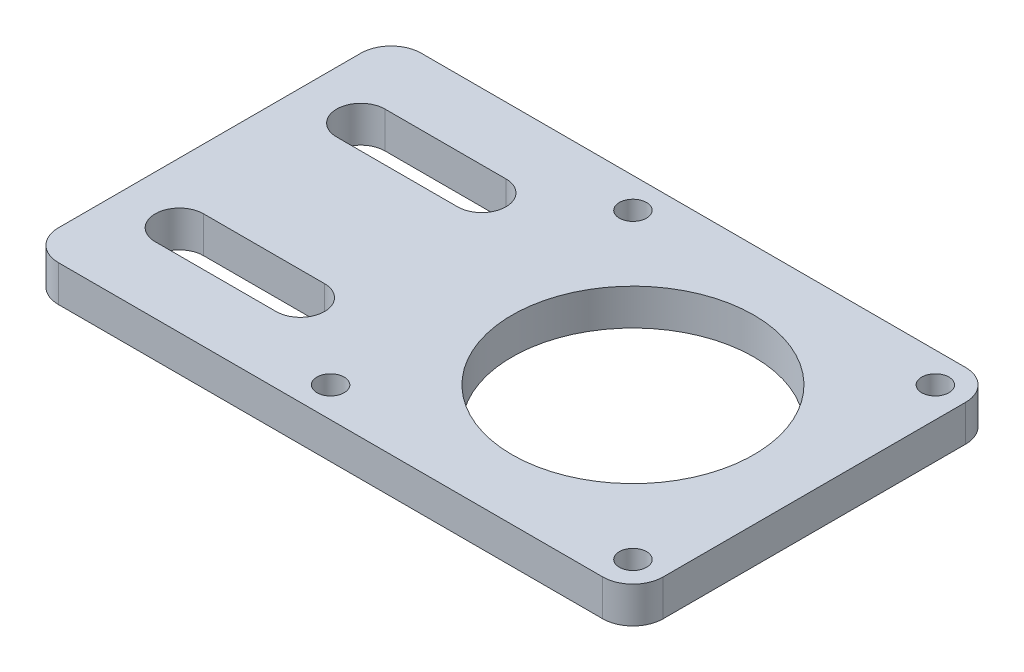
ISO-10303-21;
HEADER;
FILE_DESCRIPTION(('STEP AP214'),'2;1');
FILE_NAME('part.step','',(''),(''),'','','');
FILE_SCHEMA(('AUTOMOTIVE_DESIGN { 1 0 10303 214 1 1 1 1 }'));
ENDSEC;
DATA;
#1=APPLICATION_CONTEXT('core data for automotive mechanical design processes');
#2=APPLICATION_PROTOCOL_DEFINITION('international standard','automotive_design',2000,#1);
#3=PRODUCT_CONTEXT('',#1,'mechanical');
#4=PRODUCT('Part','Part','',(#3));
#5=PRODUCT_RELATED_PRODUCT_CATEGORY('part','',(#4));
#6=PRODUCT_DEFINITION_FORMATION('','',#4);
#7=PRODUCT_DEFINITION_CONTEXT('part definition',#1,'design');
#8=PRODUCT_DEFINITION('design','',#6,#7);
#9=PRODUCT_DEFINITION_SHAPE('','',#8);
#10=(LENGTH_UNIT() NAMED_UNIT(*) SI_UNIT(.MILLI.,.METRE.));
#11=(NAMED_UNIT(*) PLANE_ANGLE_UNIT() SI_UNIT($,.RADIAN.));
#12=(NAMED_UNIT(*) SI_UNIT($,.STERADIAN.) SOLID_ANGLE_UNIT());
#13=UNCERTAINTY_MEASURE_WITH_UNIT(LENGTH_MEASURE(1.E-05),#10,'distance_accuracy_value','');
#14=(GEOMETRIC_REPRESENTATION_CONTEXT(3) GLOBAL_UNCERTAINTY_ASSIGNED_CONTEXT((#13)) GLOBAL_UNIT_ASSIGNED_CONTEXT((#10,
#11,#12)) REPRESENTATION_CONTEXT('',''));
#15=CARTESIAN_POINT('',(0.,0.,0.));
#16=DIRECTION('',(0.,0.,1.));
#17=DIRECTION('',(1.,0.,0.));
#18=AXIS2_PLACEMENT_3D('',#15,#16,#17);
#19=CARTESIAN_POINT('',(5.,6.,25.));
#20=DIRECTION('',(0.,1.,0.));
#21=DIRECTION('',(0.,0.,1.));
#22=AXIS2_PLACEMENT_3D('',#19,#20,#21);
#23=PLANE('',#22);
#24=DIRECTION('',(1.,0.,0.));
#25=VECTOR('',#24,1.);
#26=CARTESIAN_POINT('',(10.,6.,-11.));
#27=LINE('',#26,#25);
#28=CARTESIAN_POINT('',(10.,6.,-11.));
#29=VERTEX_POINT('',#28);
#30=CARTESIAN_POINT('',(30.,6.,-11.));
#31=VERTEX_POINT('',#30);
#32=EDGE_CURVE('E214',#29,#31,#27,.T.);
#33=ORIENTED_EDGE('',*,*,#32,.F.);
#34=CARTESIAN_POINT('',(10.,6.,-15.));
#35=DIRECTION('',(0.,1.,0.));
#36=DIRECTION('',(0.,0.,1.));
#37=AXIS2_PLACEMENT_3D('',#34,#35,#36);
#38=CIRCLE('',#37,4.);
#39=CARTESIAN_POINT('',(10.,6.,-19.));
#40=VERTEX_POINT('',#39);
#41=EDGE_CURVE('E211',#40,#29,#38,.T.);
#42=ORIENTED_EDGE('',*,*,#41,.F.);
#43=DIRECTION('',(-1.,0.,0.));
#44=VECTOR('',#43,1.);
#45=CARTESIAN_POINT('',(10.,6.,-19.));
#46=LINE('',#45,#44);
#47=CARTESIAN_POINT('',(30.,6.,-19.));
#48=VERTEX_POINT('',#47);
#49=EDGE_CURVE('E222',#48,#40,#46,.T.);
#50=ORIENTED_EDGE('',*,*,#49,.F.);
#51=CARTESIAN_POINT('',(30.,6.,-15.));
#52=DIRECTION('',(0.,1.,0.));
#53=DIRECTION('',(0.,0.,1.));
#54=AXIS2_PLACEMENT_3D('',#51,#52,#53);
#55=CIRCLE('',#54,4.);
#56=EDGE_CURVE('E218',#31,#48,#55,.T.);
#57=ORIENTED_EDGE('',*,*,#56,.F.);
#58=EDGE_LOOP('',(#33,#42,#50,#57));
#59=FACE_BOUND('',#58,.T.);
#60=CARTESIAN_POINT('',(95.,6.,25.));
#61=DIRECTION('',(0.,1.,0.));
#62=DIRECTION('',(0.,0.,-1.));
#63=AXIS2_PLACEMENT_3D('',#60,#61,#62);
#64=CIRCLE('',#63,2.25);
#65=CARTESIAN_POINT('',(95.,6.,22.75));
#66=VERTEX_POINT('',#65);
#67=EDGE_CURVE('E254',#66,#66,#64,.T.);
#68=ORIENTED_EDGE('',*,*,#67,.F.);
#69=EDGE_LOOP('',(#68));
#70=FACE_BOUND('',#69,.T.);
#71=CARTESIAN_POINT('',(45.,6.,-25.));
#72=DIRECTION('',(0.,1.,0.));
#73=DIRECTION('',(0.,0.,1.));
#74=AXIS2_PLACEMENT_3D('',#71,#72,#73);
#75=CIRCLE('',#74,2.25);
#76=CARTESIAN_POINT('',(45.,6.,-22.75));
#77=VERTEX_POINT('',#76);
#78=EDGE_CURVE('E270',#77,#77,#75,.T.);
#79=ORIENTED_EDGE('',*,*,#78,.F.);
#80=EDGE_LOOP('',(#79));
#81=FACE_BOUND('',#80,.T.);
#82=CARTESIAN_POINT('',(5.,6.,25.));
#83=DIRECTION('',(0.,1.,0.));
#84=DIRECTION('',(0.,0.,1.));
#85=AXIS2_PLACEMENT_3D('',#82,#83,#84);
#86=CIRCLE('',#85,5.);
#87=CARTESIAN_POINT('',(0.,6.,25.));
#88=VERTEX_POINT('',#87);
#89=CARTESIAN_POINT('',(5.00000000000003,6.,30.));
#90=VERTEX_POINT('',#89);
#91=EDGE_CURVE('E286',#88,#90,#86,.T.);
#92=ORIENTED_EDGE('',*,*,#91,.T.);
#93=DIRECTION('',(1.,0.,0.));
#94=VECTOR('',#93,1.);
#95=CARTESIAN_POINT('',(5.00000000000003,6.,30.));
#96=LINE('',#95,#94);
#97=CARTESIAN_POINT('',(95.,6.,30.));
#98=VERTEX_POINT('',#97);
#99=EDGE_CURVE('E290',#90,#98,#96,.T.);
#100=ORIENTED_EDGE('',*,*,#99,.T.);
#101=CARTESIAN_POINT('',(95.,6.,25.));
#102=DIRECTION('',(0.,1.,0.));
#103=DIRECTION('',(0.,0.,1.));
#104=AXIS2_PLACEMENT_3D('',#101,#102,#103);
#105=CIRCLE('',#104,5.);
#106=CARTESIAN_POINT('',(100.,6.,25.));
#107=VERTEX_POINT('',#106);
#108=EDGE_CURVE('E294',#98,#107,#105,.T.);
#109=ORIENTED_EDGE('',*,*,#108,.T.);
#110=DIRECTION('',(0.,0.,-1.));
#111=VECTOR('',#110,1.);
#112=CARTESIAN_POINT('',(100.,6.,-25.));
#113=LINE('',#112,#111);
#114=CARTESIAN_POINT('',(100.,6.,-25.));
#115=VERTEX_POINT('',#114);
#116=EDGE_CURVE('E297',#107,#115,#113,.T.);
#117=ORIENTED_EDGE('',*,*,#116,.T.);
#118=CARTESIAN_POINT('',(95.,6.,-25.));
#119=DIRECTION('',(0.,1.,0.));
#120=DIRECTION('',(0.,0.,-1.));
#121=AXIS2_PLACEMENT_3D('',#118,#119,#120);
#122=CIRCLE('',#121,5.);
#123=CARTESIAN_POINT('',(95.,6.,-30.));
#124=VERTEX_POINT('',#123);
#125=EDGE_CURVE('E300',#115,#124,#122,.T.);
#126=ORIENTED_EDGE('',*,*,#125,.T.);
#127=DIRECTION('',(-1.,0.,0.));
#128=VECTOR('',#127,1.);
#129=CARTESIAN_POINT('',(5.00000000000003,6.,-30.));
#130=LINE('',#129,#128);
#131=CARTESIAN_POINT('',(5.00000000000003,6.,-30.));
#132=VERTEX_POINT('',#131);
#133=EDGE_CURVE('E303',#124,#132,#130,.T.);
#134=ORIENTED_EDGE('',*,*,#133,.T.);
#135=CARTESIAN_POINT('',(5.,6.,-25.));
#136=DIRECTION('',(0.,1.,0.));
#137=DIRECTION('',(0.,0.,1.));
#138=AXIS2_PLACEMENT_3D('',#135,#136,#137);
#139=CIRCLE('',#138,5.);
#140=CARTESIAN_POINT('',(0.,6.,-25.));
#141=VERTEX_POINT('',#140);
#142=EDGE_CURVE('E306',#132,#141,#139,.T.);
#143=ORIENTED_EDGE('',*,*,#142,.T.);
#144=DIRECTION('',(0.,0.,1.));
#145=VECTOR('',#144,1.);
#146=CARTESIAN_POINT('',(0.,6.,25.));
#147=LINE('',#146,#145);
#148=EDGE_CURVE('E309',#141,#88,#147,.T.);
#149=ORIENTED_EDGE('',*,*,#148,.T.);
#150=EDGE_LOOP('',(#92,#100,#109,#117,#126,#134,#143,#149));
#151=FACE_BOUND('',#150,.T.);
#152=CARTESIAN_POINT('',(95.,6.,-25.));
#153=DIRECTION('',(0.,1.,0.));
#154=DIRECTION('',(0.,0.,1.));
#155=AXIS2_PLACEMENT_3D('',#152,#153,#154);
#156=CIRCLE('',#155,2.25);
#157=CARTESIAN_POINT('',(95.,6.,-22.75));
#158=VERTEX_POINT('',#157);
#159=EDGE_CURVE('E278',#158,#158,#156,.T.);
#160=ORIENTED_EDGE('',*,*,#159,.F.);
#161=EDGE_LOOP('',(#160));
#162=FACE_BOUND('',#161,.T.);
#163=CARTESIAN_POINT('',(45.,6.,25.));
#164=DIRECTION('',(0.,1.,0.));
#165=DIRECTION('',(0.,0.,-1.));
#166=AXIS2_PLACEMENT_3D('',#163,#164,#165);
#167=CIRCLE('',#166,2.25);
#168=CARTESIAN_POINT('',(45.,6.,22.75));
#169=VERTEX_POINT('',#168);
#170=EDGE_CURVE('E262',#169,#169,#167,.T.);
#171=ORIENTED_EDGE('',*,*,#170,.F.);
#172=EDGE_LOOP('',(#171));
#173=FACE_BOUND('',#172,.T.);
#174=CARTESIAN_POINT('',(70.,6.,0.));
#175=DIRECTION('',(0.,1.,0.));
#176=DIRECTION('',(0.,0.,1.));
#177=AXIS2_PLACEMENT_3D('',#174,#175,#176);
#178=CIRCLE('',#177,20.);
#179=CARTESIAN_POINT('',(70.,6.,20.));
#180=VERTEX_POINT('',#179);
#181=EDGE_CURVE('E203',#180,#180,#178,.T.);
#182=ORIENTED_EDGE('',*,*,#181,.F.);
#183=EDGE_LOOP('',(#182));
#184=FACE_BOUND('',#183,.T.);
#185=DIRECTION('',(1.,0.,0.));
#186=VECTOR('',#185,1.);
#187=CARTESIAN_POINT('',(10.,6.,19.));
#188=LINE('',#187,#186);
#189=CARTESIAN_POINT('',(10.,6.,19.));
#190=VERTEX_POINT('',#189);
#191=CARTESIAN_POINT('',(30.,6.,19.));
#192=VERTEX_POINT('',#191);
#193=EDGE_CURVE('E164',#190,#192,#188,.T.);
#194=ORIENTED_EDGE('',*,*,#193,.F.);
#195=CARTESIAN_POINT('',(10.,6.,15.));
#196=DIRECTION('',(0.,1.,0.));
#197=DIRECTION('',(0.,0.,-1.));
#198=AXIS2_PLACEMENT_3D('',#195,#196,#197);
#199=CIRCLE('',#198,4.);
#200=CARTESIAN_POINT('',(10.,6.,11.));
#201=VERTEX_POINT('',#200);
#202=EDGE_CURVE('E155',#201,#190,#199,.T.);
#203=ORIENTED_EDGE('',*,*,#202,.F.);
#204=DIRECTION('',(-1.,0.,0.));
#205=VECTOR('',#204,1.);
#206=CARTESIAN_POINT('',(10.,6.,11.));
#207=LINE('',#206,#205);
#208=CARTESIAN_POINT('',(30.,6.,11.));
#209=VERTEX_POINT('',#208);
#210=EDGE_CURVE('E181',#209,#201,#207,.T.);
#211=ORIENTED_EDGE('',*,*,#210,.F.);
#212=CARTESIAN_POINT('',(30.,6.,15.));
#213=DIRECTION('',(0.,1.,0.));
#214=DIRECTION('',(0.,0.,-1.));
#215=AXIS2_PLACEMENT_3D('',#212,#213,#214);
#216=CIRCLE('',#215,4.);
#217=EDGE_CURVE('E177',#192,#209,#216,.T.);
#218=ORIENTED_EDGE('',*,*,#217,.F.);
#219=EDGE_LOOP('',(#194,#203,#211,#218));
#220=FACE_BOUND('',#219,.T.);
#221=ADVANCED_FACE('F41',(#59,#70,#81,#151,#162,#173,#184,#220),#23,.T.);
#222=CARTESIAN_POINT('',(5.,0.,25.));
#223=DIRECTION('',(0.,1.,0.));
#224=DIRECTION('',(0.,0.,1.));
#225=AXIS2_PLACEMENT_3D('',#222,#223,#224);
#226=PLANE('',#225);
#227=CARTESIAN_POINT('',(70.,0.,0.));
#228=DIRECTION('',(0.,1.,0.));
#229=DIRECTION('',(0.,0.,1.));
#230=AXIS2_PLACEMENT_3D('',#227,#228,#229);
#231=CIRCLE('',#230,20.);
#232=CARTESIAN_POINT('',(70.,0.,20.));
#233=VERTEX_POINT('',#232);
#234=EDGE_CURVE('E173',#233,#233,#231,.T.);
#235=ORIENTED_EDGE('',*,*,#234,.T.);
#236=EDGE_LOOP('',(#235));
#237=FACE_BOUND('',#236,.T.);
#238=CARTESIAN_POINT('',(10.,0.,-15.));
#239=DIRECTION('',(0.,1.,0.));
#240=DIRECTION('',(0.,0.,1.));
#241=AXIS2_PLACEMENT_3D('',#238,#239,#240);
#242=CIRCLE('',#241,4.);
#243=CARTESIAN_POINT('',(10.,0.,-19.));
#244=VERTEX_POINT('',#243);
#245=CARTESIAN_POINT('',(10.,0.,-11.));
#246=VERTEX_POINT('',#245);
#247=EDGE_CURVE('E207',#244,#246,#242,.T.);
#248=ORIENTED_EDGE('',*,*,#247,.T.);
#249=DIRECTION('',(1.,0.,0.));
#250=VECTOR('',#249,1.);
#251=CARTESIAN_POINT('',(10.,0.,-11.));
#252=LINE('',#251,#250);
#253=CARTESIAN_POINT('',(30.,0.,-11.));
#254=VERTEX_POINT('',#253);
#255=EDGE_CURVE('E229',#246,#254,#252,.T.);
#256=ORIENTED_EDGE('',*,*,#255,.T.);
#257=CARTESIAN_POINT('',(30.,0.,-15.));
#258=DIRECTION('',(0.,1.,0.));
#259=DIRECTION('',(0.,0.,1.));
#260=AXIS2_PLACEMENT_3D('',#257,#258,#259);
#261=CIRCLE('',#260,4.);
#262=CARTESIAN_POINT('',(30.,0.,-19.));
#263=VERTEX_POINT('',#262);
#264=EDGE_CURVE('E233',#254,#263,#261,.T.);
#265=ORIENTED_EDGE('',*,*,#264,.T.);
#266=DIRECTION('',(-1.,0.,0.));
#267=VECTOR('',#266,1.);
#268=CARTESIAN_POINT('',(10.,0.,-19.));
#269=LINE('',#268,#267);
#270=EDGE_CURVE('E215',#263,#244,#269,.T.);
#271=ORIENTED_EDGE('',*,*,#270,.T.);
#272=EDGE_LOOP('',(#248,#256,#265,#271));
#273=FACE_BOUND('',#272,.T.);
#274=CARTESIAN_POINT('',(5.,0.,25.));
#275=DIRECTION('',(0.,1.,0.));
#276=DIRECTION('',(0.,0.,1.));
#277=AXIS2_PLACEMENT_3D('',#274,#275,#276);
#278=CIRCLE('',#277,5.);
#279=CARTESIAN_POINT('',(0.,0.,25.));
#280=VERTEX_POINT('',#279);
#281=CARTESIAN_POINT('',(5.00000000000003,0.,30.));
#282=VERTEX_POINT('',#281);
#283=EDGE_CURVE('E282',#280,#282,#278,.T.);
#284=ORIENTED_EDGE('',*,*,#283,.F.);
#285=DIRECTION('',(0.,0.,1.));
#286=VECTOR('',#285,1.);
#287=CARTESIAN_POINT('',(0.,0.,25.));
#288=LINE('',#287,#286);
#289=CARTESIAN_POINT('',(0.,0.,-25.));
#290=VERTEX_POINT('',#289);
#291=EDGE_CURVE('E291',#290,#280,#288,.T.);
#292=ORIENTED_EDGE('',*,*,#291,.F.);
#293=CARTESIAN_POINT('',(5.,0.,-25.));
#294=DIRECTION('',(0.,1.,0.));
#295=DIRECTION('',(0.,0.,1.));
#296=AXIS2_PLACEMENT_3D('',#293,#294,#295);
#297=CIRCLE('',#296,5.);
#298=CARTESIAN_POINT('',(5.00000000000003,0.,-30.));
#299=VERTEX_POINT('',#298);
#300=EDGE_CURVE('E331',#299,#290,#297,.T.);
#301=ORIENTED_EDGE('',*,*,#300,.F.);
#302=DIRECTION('',(-1.,0.,0.));
#303=VECTOR('',#302,1.);
#304=CARTESIAN_POINT('',(5.00000000000003,0.,-30.));
#305=LINE('',#304,#303);
#306=CARTESIAN_POINT('',(95.,0.,-30.));
#307=VERTEX_POINT('',#306);
#308=EDGE_CURVE('E328',#307,#299,#305,.T.);
#309=ORIENTED_EDGE('',*,*,#308,.F.);
#310=CARTESIAN_POINT('',(95.,0.,-25.));
#311=DIRECTION('',(0.,1.,0.));
#312=DIRECTION('',(0.,0.,-1.));
#313=AXIS2_PLACEMENT_3D('',#310,#311,#312);
#314=CIRCLE('',#313,5.);
#315=CARTESIAN_POINT('',(100.,0.,-25.));
#316=VERTEX_POINT('',#315);
#317=EDGE_CURVE('E325',#316,#307,#314,.T.);
#318=ORIENTED_EDGE('',*,*,#317,.F.);
#319=DIRECTION('',(0.,0.,-1.));
#320=VECTOR('',#319,1.);
#321=CARTESIAN_POINT('',(100.,0.,-25.));
#322=LINE('',#321,#320);
#323=CARTESIAN_POINT('',(100.,0.,25.));
#324=VERTEX_POINT('',#323);
#325=EDGE_CURVE('E322',#324,#316,#322,.T.);
#326=ORIENTED_EDGE('',*,*,#325,.F.);
#327=CARTESIAN_POINT('',(95.,0.,25.));
#328=DIRECTION('',(0.,1.,0.));
#329=DIRECTION('',(0.,0.,1.));
#330=AXIS2_PLACEMENT_3D('',#327,#328,#329);
#331=CIRCLE('',#330,5.);
#332=CARTESIAN_POINT('',(95.,0.,30.));
#333=VERTEX_POINT('',#332);
#334=EDGE_CURVE('E319',#333,#324,#331,.T.);
#335=ORIENTED_EDGE('',*,*,#334,.F.);
#336=DIRECTION('',(1.,0.,0.));
#337=VECTOR('',#336,1.);
#338=CARTESIAN_POINT('',(5.00000000000003,0.,30.));
#339=LINE('',#338,#337);
#340=EDGE_CURVE('E316',#282,#333,#339,.T.);
#341=ORIENTED_EDGE('',*,*,#340,.F.);
#342=EDGE_LOOP('',(#284,#292,#301,#309,#318,#326,#335,#341));
#343=FACE_BOUND('',#342,.T.);
#344=CARTESIAN_POINT('',(95.,0.,-25.));
#345=DIRECTION('',(0.,1.,0.));
#346=DIRECTION('',(0.,0.,1.));
#347=AXIS2_PLACEMENT_3D('',#344,#345,#346);
#348=CIRCLE('',#347,2.25);
#349=CARTESIAN_POINT('',(95.,0.,-22.75));
#350=VERTEX_POINT('',#349);
#351=EDGE_CURVE('E274',#350,#350,#348,.T.);
#352=ORIENTED_EDGE('',*,*,#351,.T.);
#353=EDGE_LOOP('',(#352));
#354=FACE_BOUND('',#353,.T.);
#355=CARTESIAN_POINT('',(45.,0.,-25.));
#356=DIRECTION('',(0.,1.,0.));
#357=DIRECTION('',(0.,0.,1.));
#358=AXIS2_PLACEMENT_3D('',#355,#356,#357);
#359=CIRCLE('',#358,2.25);
#360=CARTESIAN_POINT('',(45.,0.,-22.75));
#361=VERTEX_POINT('',#360);
#362=EDGE_CURVE('E266',#361,#361,#359,.T.);
#363=ORIENTED_EDGE('',*,*,#362,.T.);
#364=EDGE_LOOP('',(#363));
#365=FACE_BOUND('',#364,.T.);
#366=CARTESIAN_POINT('',(45.,0.,25.));
#367=DIRECTION('',(0.,1.,0.));
#368=DIRECTION('',(0.,0.,-1.));
#369=AXIS2_PLACEMENT_3D('',#366,#367,#368);
#370=CIRCLE('',#369,2.25);
#371=CARTESIAN_POINT('',(45.,0.,22.75));
#372=VERTEX_POINT('',#371);
#373=EDGE_CURVE('E258',#372,#372,#370,.T.);
#374=ORIENTED_EDGE('',*,*,#373,.T.);
#375=EDGE_LOOP('',(#374));
#376=FACE_BOUND('',#375,.T.);
#377=CARTESIAN_POINT('',(95.,0.,25.));
#378=DIRECTION('',(0.,1.,0.));
#379=DIRECTION('',(0.,0.,-1.));
#380=AXIS2_PLACEMENT_3D('',#377,#378,#379);
#381=CIRCLE('',#380,2.25);
#382=CARTESIAN_POINT('',(95.,0.,22.75));
#383=VERTEX_POINT('',#382);
#384=EDGE_CURVE('E253',#383,#383,#381,.T.);
#385=ORIENTED_EDGE('',*,*,#384,.T.);
#386=EDGE_LOOP('',(#385));
#387=FACE_BOUND('',#386,.T.);
#388=CARTESIAN_POINT('',(10.,0.,15.));
#389=DIRECTION('',(0.,1.,0.));
#390=DIRECTION('',(0.,0.,-1.));
#391=AXIS2_PLACEMENT_3D('',#388,#389,#390);
#392=CIRCLE('',#391,4.);
#393=CARTESIAN_POINT('',(10.,0.,11.));
#394=VERTEX_POINT('',#393);
#395=CARTESIAN_POINT('',(10.,0.,19.));
#396=VERTEX_POINT('',#395);
#397=EDGE_CURVE('E65',#394,#396,#392,.T.);
#398=ORIENTED_EDGE('',*,*,#397,.T.);
#399=DIRECTION('',(1.,0.,0.));
#400=VECTOR('',#399,1.);
#401=CARTESIAN_POINT('',(10.,0.,19.));
#402=LINE('',#401,#400);
#403=CARTESIAN_POINT('',(30.,0.,19.));
#404=VERTEX_POINT('',#403);
#405=EDGE_CURVE('E171',#396,#404,#402,.T.);
#406=ORIENTED_EDGE('',*,*,#405,.T.);
#407=CARTESIAN_POINT('',(30.,0.,15.));
#408=DIRECTION('',(0.,1.,0.));
#409=DIRECTION('',(0.,0.,-1.));
#410=AXIS2_PLACEMENT_3D('',#407,#408,#409);
#411=CIRCLE('',#410,4.);
#412=CARTESIAN_POINT('',(30.,0.,11.));
#413=VERTEX_POINT('',#412);
#414=EDGE_CURVE('E190',#404,#413,#411,.T.);
#415=ORIENTED_EDGE('',*,*,#414,.T.);
#416=DIRECTION('',(-1.,0.,0.));
#417=VECTOR('',#416,1.);
#418=CARTESIAN_POINT('',(10.,0.,11.));
#419=LINE('',#418,#417);
#420=EDGE_CURVE('E165',#413,#394,#419,.T.);
#421=ORIENTED_EDGE('',*,*,#420,.T.);
#422=EDGE_LOOP('',(#398,#406,#415,#421));
#423=FACE_BOUND('',#422,.T.);
#424=ADVANCED_FACE('F370',(#237,#273,#343,#354,#365,#376,#387,#423),#226,.F.);
#425=CARTESIAN_POINT('',(5.,6.,25.));
#426=DIRECTION('',(0.,-1.,0.));
#427=DIRECTION('',(0.,0.,-1.));
#428=AXIS2_PLACEMENT_3D('',#425,#426,#427);
#429=CYLINDRICAL_SURFACE('',#428,5.);
#430=ORIENTED_EDGE('',*,*,#283,.T.);
#431=DIRECTION('',(0.,-1.,0.));
#432=VECTOR('',#431,1.);
#433=CARTESIAN_POINT('',(5.00000000000003,6.,30.));
#434=LINE('',#433,#432);
#435=EDGE_CURVE('E11',#90,#282,#434,.T.);
#436=ORIENTED_EDGE('',*,*,#435,.F.);
#437=ORIENTED_EDGE('',*,*,#91,.F.);
#438=DIRECTION('',(0.,-1.,0.));
#439=VECTOR('',#438,1.);
#440=CARTESIAN_POINT('',(0.,6.,25.));
#441=LINE('',#440,#439);
#442=EDGE_CURVE('E312',#88,#280,#441,.T.);
#443=ORIENTED_EDGE('',*,*,#442,.T.);
#444=EDGE_LOOP('',(#430,#436,#437,#443));
#445=FACE_BOUND('',#444,.T.);
#446=ADVANCED_FACE('F43',(#445),#429,.T.);
#447=CARTESIAN_POINT('',(5.00000000000003,6.,30.));
#448=DIRECTION('',(0.,0.,-1.));
#449=DIRECTION('',(-1.,0.,0.));
#450=AXIS2_PLACEMENT_3D('',#447,#448,#449);
#451=PLANE('',#450);
#452=ORIENTED_EDGE('',*,*,#340,.T.);
#453=DIRECTION('',(0.,-1.,0.));
#454=VECTOR('',#453,1.);
#455=CARTESIAN_POINT('',(95.,6.,30.));
#456=LINE('',#455,#454);
#457=EDGE_CURVE('E50',#98,#333,#456,.T.);
#458=ORIENTED_EDGE('',*,*,#457,.F.);
#459=ORIENTED_EDGE('',*,*,#99,.F.);
#460=ORIENTED_EDGE('',*,*,#435,.T.);
#461=EDGE_LOOP('',(#452,#458,#459,#460));
#462=FACE_BOUND('',#461,.T.);
#463=ADVANCED_FACE('F388',(#462),#451,.F.);
#464=CARTESIAN_POINT('',(95.,6.,25.));
#465=DIRECTION('',(0.,-1.,0.));
#466=DIRECTION('',(0.,0.,-1.));
#467=AXIS2_PLACEMENT_3D('',#464,#465,#466);
#468=CYLINDRICAL_SURFACE('',#467,5.);
#469=ORIENTED_EDGE('',*,*,#334,.T.);
#470=DIRECTION('',(0.,-1.,0.));
#471=VECTOR('',#470,1.);
#472=CARTESIAN_POINT('',(100.,6.,25.));
#473=LINE('',#472,#471);
#474=EDGE_CURVE('E355',#107,#324,#473,.T.);
#475=ORIENTED_EDGE('',*,*,#474,.F.);
#476=ORIENTED_EDGE('',*,*,#108,.F.);
#477=ORIENTED_EDGE('',*,*,#457,.T.);
#478=EDGE_LOOP('',(#469,#475,#476,#477));
#479=FACE_BOUND('',#478,.T.);
#480=ADVANCED_FACE('F364',(#479),#468,.T.);
#481=CARTESIAN_POINT('',(100.,6.,-25.));
#482=DIRECTION('',(-1.,0.,0.));
#483=DIRECTION('',(0.,0.,1.));
#484=AXIS2_PLACEMENT_3D('',#481,#482,#483);
#485=PLANE('',#484);
#486=ORIENTED_EDGE('',*,*,#325,.T.);
#487=DIRECTION('',(0.,-1.,0.));
#488=VECTOR('',#487,1.);
#489=CARTESIAN_POINT('',(100.,6.,-25.));
#490=LINE('',#489,#488);
#491=EDGE_CURVE('E351',#115,#316,#490,.T.);
#492=ORIENTED_EDGE('',*,*,#491,.F.);
#493=ORIENTED_EDGE('',*,*,#116,.F.);
#494=ORIENTED_EDGE('',*,*,#474,.T.);
#495=EDGE_LOOP('',(#486,#492,#493,#494));
#496=FACE_BOUND('',#495,.T.);
#497=ADVANCED_FACE('F376',(#496),#485,.F.);
#498=CARTESIAN_POINT('',(95.,6.,-25.));
#499=DIRECTION('',(0.,-1.,0.));
#500=DIRECTION('',(0.,0.,-1.));
#501=AXIS2_PLACEMENT_3D('',#498,#499,#500);
#502=CYLINDRICAL_SURFACE('',#501,5.);
#503=ORIENTED_EDGE('',*,*,#317,.T.);
#504=DIRECTION('',(0.,-1.,0.));
#505=VECTOR('',#504,1.);
#506=CARTESIAN_POINT('',(95.,6.,-30.));
#507=LINE('',#506,#505);
#508=EDGE_CURVE('E347',#124,#307,#507,.T.);
#509=ORIENTED_EDGE('',*,*,#508,.F.);
#510=ORIENTED_EDGE('',*,*,#125,.F.);
#511=ORIENTED_EDGE('',*,*,#491,.T.);
#512=EDGE_LOOP('',(#503,#509,#510,#511));
#513=FACE_BOUND('',#512,.T.);
#514=ADVANCED_FACE('F380',(#513),#502,.T.);
#515=CARTESIAN_POINT('',(5.00000000000003,6.,-30.));
#516=DIRECTION('',(0.,0.,1.));
#517=DIRECTION('',(1.,0.,0.));
#518=AXIS2_PLACEMENT_3D('',#515,#516,#517);
#519=PLANE('',#518);
#520=ORIENTED_EDGE('',*,*,#308,.T.);
#521=DIRECTION('',(0.,-1.,0.));
#522=VECTOR('',#521,1.);
#523=CARTESIAN_POINT('',(5.00000000000003,6.,-30.));
#524=LINE('',#523,#522);
#525=EDGE_CURVE('E343',#132,#299,#524,.T.);
#526=ORIENTED_EDGE('',*,*,#525,.F.);
#527=ORIENTED_EDGE('',*,*,#133,.F.);
#528=ORIENTED_EDGE('',*,*,#508,.T.);
#529=EDGE_LOOP('',(#520,#526,#527,#528));
#530=FACE_BOUND('',#529,.T.);
#531=ADVANCED_FACE('F401',(#530),#519,.F.);
#532=CARTESIAN_POINT('',(5.,6.,-25.));
#533=DIRECTION('',(0.,-1.,0.));
#534=DIRECTION('',(0.,0.,-1.));
#535=AXIS2_PLACEMENT_3D('',#532,#533,#534);
#536=CYLINDRICAL_SURFACE('',#535,5.);
#537=ORIENTED_EDGE('',*,*,#300,.T.);
#538=DIRECTION('',(0.,-1.,0.));
#539=VECTOR('',#538,1.);
#540=CARTESIAN_POINT('',(0.,6.,-25.));
#541=LINE('',#540,#539);
#542=EDGE_CURVE('E339',#141,#290,#541,.T.);
#543=ORIENTED_EDGE('',*,*,#542,.F.);
#544=ORIENTED_EDGE('',*,*,#142,.F.);
#545=ORIENTED_EDGE('',*,*,#525,.T.);
#546=EDGE_LOOP('',(#537,#543,#544,#545));
#547=FACE_BOUND('',#546,.T.);
#548=ADVANCED_FACE('F399',(#547),#536,.T.);
#549=CARTESIAN_POINT('',(0.,6.,25.));
#550=DIRECTION('',(1.,0.,0.));
#551=DIRECTION('',(0.,0.,-1.));
#552=AXIS2_PLACEMENT_3D('',#549,#550,#551);
#553=PLANE('',#552);
#554=ORIENTED_EDGE('',*,*,#291,.T.);
#555=ORIENTED_EDGE('',*,*,#442,.F.);
#556=ORIENTED_EDGE('',*,*,#148,.F.);
#557=ORIENTED_EDGE('',*,*,#542,.T.);
#558=EDGE_LOOP('',(#554,#555,#556,#557));
#559=FACE_BOUND('',#558,.T.);
#560=ADVANCED_FACE('F394',(#559),#553,.F.);
#561=CARTESIAN_POINT('',(95.,6.,-25.));
#562=DIRECTION('',(0.,-1.,0.));
#563=DIRECTION('',(0.,0.,-1.));
#564=AXIS2_PLACEMENT_3D('',#561,#562,#563);
#565=CYLINDRICAL_SURFACE('',#564,2.25);
#566=ORIENTED_EDGE('',*,*,#159,.T.);
#567=EDGE_LOOP('',(#566));
#568=FACE_BOUND('',#567,.T.);
#569=ORIENTED_EDGE('',*,*,#351,.F.);
#570=EDGE_LOOP('',(#569));
#571=FACE_BOUND('',#570,.T.);
#572=ADVANCED_FACE('F421',(#568,#571),#565,.F.);
#573=CARTESIAN_POINT('',(45.,6.,-25.));
#574=DIRECTION('',(0.,-1.,0.));
#575=DIRECTION('',(0.,0.,-1.));
#576=AXIS2_PLACEMENT_3D('',#573,#574,#575);
#577=CYLINDRICAL_SURFACE('',#576,2.25);
#578=ORIENTED_EDGE('',*,*,#78,.T.);
#579=EDGE_LOOP('',(#578));
#580=FACE_BOUND('',#579,.T.);
#581=ORIENTED_EDGE('',*,*,#362,.F.);
#582=EDGE_LOOP('',(#581));
#583=FACE_BOUND('',#582,.T.);
#584=ADVANCED_FACE('F428',(#580,#583),#577,.F.);
#585=CARTESIAN_POINT('',(45.,6.,25.));
#586=DIRECTION('',(0.,-1.,0.));
#587=DIRECTION('',(0.,0.,-1.));
#588=AXIS2_PLACEMENT_3D('',#585,#586,#587);
#589=CYLINDRICAL_SURFACE('',#588,2.25);
#590=ORIENTED_EDGE('',*,*,#170,.T.);
#591=EDGE_LOOP('',(#590));
#592=FACE_BOUND('',#591,.T.);
#593=ORIENTED_EDGE('',*,*,#373,.F.);
#594=EDGE_LOOP('',(#593));
#595=FACE_BOUND('',#594,.T.);
#596=ADVANCED_FACE('F433',(#592,#595),#589,.F.);
#597=CARTESIAN_POINT('',(95.,6.,25.));
#598=DIRECTION('',(0.,-1.,0.));
#599=DIRECTION('',(0.,0.,-1.));
#600=AXIS2_PLACEMENT_3D('',#597,#598,#599);
#601=CYLINDRICAL_SURFACE('',#600,2.25);
#602=ORIENTED_EDGE('',*,*,#67,.T.);
#603=EDGE_LOOP('',(#602));
#604=FACE_BOUND('',#603,.T.);
#605=ORIENTED_EDGE('',*,*,#384,.F.);
#606=EDGE_LOOP('',(#605));
#607=FACE_BOUND('',#606,.T.);
#608=ADVANCED_FACE('F479',(#604,#607),#601,.F.);
#609=CARTESIAN_POINT('',(10.,6.,-15.));
#610=DIRECTION('',(0.,-1.,0.));
#611=DIRECTION('',(0.,0.,-1.));
#612=AXIS2_PLACEMENT_3D('',#609,#610,#611);
#613=CYLINDRICAL_SURFACE('',#612,4.);
#614=ORIENTED_EDGE('',*,*,#247,.F.);
#615=DIRECTION('',(0.,-1.,0.));
#616=VECTOR('',#615,1.);
#617=CARTESIAN_POINT('',(10.,6.,-19.));
#618=LINE('',#617,#616);
#619=EDGE_CURVE('E225',#40,#244,#618,.T.);
#620=ORIENTED_EDGE('',*,*,#619,.F.);
#621=ORIENTED_EDGE('',*,*,#41,.T.);
#622=DIRECTION('',(0.,-1.,0.));
#623=VECTOR('',#622,1.);
#624=CARTESIAN_POINT('',(10.,6.,-11.));
#625=LINE('',#624,#623);
#626=EDGE_CURVE('E249',#29,#246,#625,.T.);
#627=ORIENTED_EDGE('',*,*,#626,.T.);
#628=EDGE_LOOP('',(#614,#620,#621,#627));
#629=FACE_BOUND('',#628,.T.);
#630=ADVANCED_FACE('F475',(#629),#613,.F.);
#631=CARTESIAN_POINT('',(10.,6.,-11.));
#632=DIRECTION('',(0.,0.,-1.));
#633=DIRECTION('',(-1.,0.,0.));
#634=AXIS2_PLACEMENT_3D('',#631,#632,#633);
#635=PLANE('',#634);
#636=ORIENTED_EDGE('',*,*,#255,.F.);
#637=ORIENTED_EDGE('',*,*,#626,.F.);
#638=ORIENTED_EDGE('',*,*,#32,.T.);
#639=DIRECTION('',(0.,-1.,0.));
#640=VECTOR('',#639,1.);
#641=CARTESIAN_POINT('',(30.,6.,-11.));
#642=LINE('',#641,#640);
#643=EDGE_CURVE('E246',#31,#254,#642,.T.);
#644=ORIENTED_EDGE('',*,*,#643,.T.);
#645=EDGE_LOOP('',(#636,#637,#638,#644));
#646=FACE_BOUND('',#645,.T.);
#647=ADVANCED_FACE('F471',(#646),#635,.T.);
#648=CARTESIAN_POINT('',(30.,6.,-15.));
#649=DIRECTION('',(0.,-1.,0.));
#650=DIRECTION('',(0.,0.,-1.));
#651=AXIS2_PLACEMENT_3D('',#648,#649,#650);
#652=CYLINDRICAL_SURFACE('',#651,4.);
#653=ORIENTED_EDGE('',*,*,#264,.F.);
#654=ORIENTED_EDGE('',*,*,#643,.F.);
#655=ORIENTED_EDGE('',*,*,#56,.T.);
#656=DIRECTION('',(0.,-1.,0.));
#657=VECTOR('',#656,1.);
#658=CARTESIAN_POINT('',(30.,6.,-19.));
#659=LINE('',#658,#657);
#660=EDGE_CURVE('E243',#48,#263,#659,.T.);
#661=ORIENTED_EDGE('',*,*,#660,.T.);
#662=EDGE_LOOP('',(#653,#654,#655,#661));
#663=FACE_BOUND('',#662,.T.);
#664=ADVANCED_FACE('F467',(#663),#652,.F.);
#665=CARTESIAN_POINT('',(10.,6.,-19.));
#666=DIRECTION('',(0.,0.,1.));
#667=DIRECTION('',(1.,0.,0.));
#668=AXIS2_PLACEMENT_3D('',#665,#666,#667);
#669=PLANE('',#668);
#670=ORIENTED_EDGE('',*,*,#270,.F.);
#671=ORIENTED_EDGE('',*,*,#660,.F.);
#672=ORIENTED_EDGE('',*,*,#49,.T.);
#673=ORIENTED_EDGE('',*,*,#619,.T.);
#674=EDGE_LOOP('',(#670,#671,#672,#673));
#675=FACE_BOUND('',#674,.T.);
#676=ADVANCED_FACE('F463',(#675),#669,.T.);
#677=CARTESIAN_POINT('',(70.,6.,0.));
#678=DIRECTION('',(0.,-1.,0.));
#679=DIRECTION('',(0.,0.,-1.));
#680=AXIS2_PLACEMENT_3D('',#677,#678,#679);
#681=CYLINDRICAL_SURFACE('',#680,20.);
#682=ORIENTED_EDGE('',*,*,#181,.T.);
#683=EDGE_LOOP('',(#682));
#684=FACE_BOUND('',#683,.T.);
#685=ORIENTED_EDGE('',*,*,#234,.F.);
#686=EDGE_LOOP('',(#685));
#687=FACE_BOUND('',#686,.T.);
#688=ADVANCED_FACE('F460',(#684,#687),#681,.F.);
#689=CARTESIAN_POINT('',(10.,6.,15.));
#690=DIRECTION('',(0.,-1.,0.));
#691=DIRECTION('',(0.,0.,-1.));
#692=AXIS2_PLACEMENT_3D('',#689,#690,#691);
#693=CYLINDRICAL_SURFACE('',#692,4.);
#694=ORIENTED_EDGE('',*,*,#397,.F.);
#695=DIRECTION('',(0.,-1.,0.));
#696=VECTOR('',#695,1.);
#697=CARTESIAN_POINT('',(10.,6.,11.));
#698=LINE('',#697,#696);
#699=EDGE_CURVE('E159',#201,#394,#698,.T.);
#700=ORIENTED_EDGE('',*,*,#699,.F.);
#701=ORIENTED_EDGE('',*,*,#202,.T.);
#702=DIRECTION('',(0.,-1.,0.));
#703=VECTOR('',#702,1.);
#704=CARTESIAN_POINT('',(10.,6.,19.));
#705=LINE('',#704,#703);
#706=EDGE_CURVE('E158',#190,#396,#705,.T.);
#707=ORIENTED_EDGE('',*,*,#706,.T.);
#708=EDGE_LOOP('',(#694,#700,#701,#707));
#709=FACE_BOUND('',#708,.T.);
#710=ADVANCED_FACE('F157',(#709),#693,.F.);
#711=CARTESIAN_POINT('',(10.,6.,19.));
#712=DIRECTION('',(0.,0.,-1.));
#713=DIRECTION('',(-1.,0.,0.));
#714=AXIS2_PLACEMENT_3D('',#711,#712,#713);
#715=PLANE('',#714);
#716=ORIENTED_EDGE('',*,*,#405,.F.);
#717=ORIENTED_EDGE('',*,*,#706,.F.);
#718=ORIENTED_EDGE('',*,*,#193,.T.);
#719=DIRECTION('',(0.,-1.,0.));
#720=VECTOR('',#719,1.);
#721=CARTESIAN_POINT('',(30.,6.,19.));
#722=LINE('',#721,#720);
#723=EDGE_CURVE('E174',#192,#404,#722,.T.);
#724=ORIENTED_EDGE('',*,*,#723,.T.);
#725=EDGE_LOOP('',(#716,#717,#718,#724));
#726=FACE_BOUND('',#725,.T.);
#727=ADVANCED_FACE('F168',(#726),#715,.T.);
#728=CARTESIAN_POINT('',(30.,6.,15.));
#729=DIRECTION('',(0.,-1.,0.));
#730=DIRECTION('',(0.,0.,-1.));
#731=AXIS2_PLACEMENT_3D('',#728,#729,#730);
#732=CYLINDRICAL_SURFACE('',#731,4.);
#733=ORIENTED_EDGE('',*,*,#414,.F.);
#734=ORIENTED_EDGE('',*,*,#723,.F.);
#735=ORIENTED_EDGE('',*,*,#217,.T.);
#736=DIRECTION('',(0.,-1.,0.));
#737=VECTOR('',#736,1.);
#738=CARTESIAN_POINT('',(30.,6.,11.));
#739=LINE('',#738,#737);
#740=EDGE_CURVE('E57',#209,#413,#739,.T.);
#741=ORIENTED_EDGE('',*,*,#740,.T.);
#742=EDGE_LOOP('',(#733,#734,#735,#741));
#743=FACE_BOUND('',#742,.T.);
#744=ADVANCED_FACE('F448',(#743),#732,.F.);
#745=CARTESIAN_POINT('',(10.,6.,11.));
#746=DIRECTION('',(0.,0.,1.));
#747=DIRECTION('',(1.,0.,0.));
#748=AXIS2_PLACEMENT_3D('',#745,#746,#747);
#749=PLANE('',#748);
#750=ORIENTED_EDGE('',*,*,#420,.F.);
#751=ORIENTED_EDGE('',*,*,#740,.F.);
#752=ORIENTED_EDGE('',*,*,#210,.T.);
#753=ORIENTED_EDGE('',*,*,#699,.T.);
#754=EDGE_LOOP('',(#750,#751,#752,#753));
#755=FACE_BOUND('',#754,.T.);
#756=ADVANCED_FACE('F446',(#755),#749,.T.);
#757=CLOSED_SHELL('',(#221,#424,#446,#463,#480,#497,#514,#531,#548,#560,#572,#584,#596,#608,
#630,#647,#664,#676,#688,#710,#727,#744,#756));
#758=MANIFOLD_SOLID_BREP('B2',#757);
#759=ADVANCED_BREP_SHAPE_REPRESENTATION('',(#18,#758),#14);
#760=SHAPE_DEFINITION_REPRESENTATION(#9,#759);
ENDSEC;
END-ISO-10303-21;
